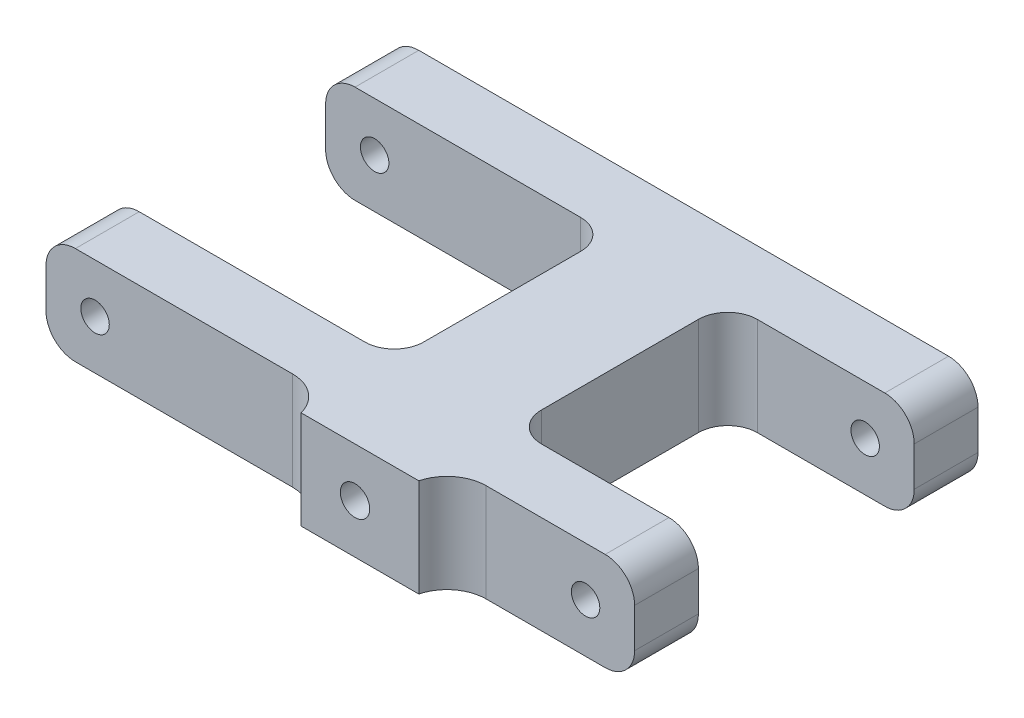
ISO-10303-21;
HEADER;
FILE_DESCRIPTION(('STEP AP214'),'2;1');
FILE_NAME('part.step','',(''),(''),'','','');
FILE_SCHEMA(('AUTOMOTIVE_DESIGN { 1 0 10303 214 1 1 1 1 }'));
ENDSEC;
DATA;
#1=APPLICATION_CONTEXT('core data for automotive mechanical design processes');
#2=APPLICATION_PROTOCOL_DEFINITION('international standard','automotive_design',2000,#1);
#3=PRODUCT_CONTEXT('',#1,'mechanical');
#4=PRODUCT('Part','Part','',(#3));
#5=PRODUCT_RELATED_PRODUCT_CATEGORY('part','',(#4));
#6=PRODUCT_DEFINITION_FORMATION('','',#4);
#7=PRODUCT_DEFINITION_CONTEXT('part definition',#1,'design');
#8=PRODUCT_DEFINITION('design','',#6,#7);
#9=PRODUCT_DEFINITION_SHAPE('','',#8);
#10=(LENGTH_UNIT() NAMED_UNIT(*) SI_UNIT(.MILLI.,.METRE.));
#11=(NAMED_UNIT(*) PLANE_ANGLE_UNIT() SI_UNIT($,.RADIAN.));
#12=(NAMED_UNIT(*) SI_UNIT($,.STERADIAN.) SOLID_ANGLE_UNIT());
#13=UNCERTAINTY_MEASURE_WITH_UNIT(LENGTH_MEASURE(1.E-05),#10,'distance_accuracy_value','');
#14=(GEOMETRIC_REPRESENTATION_CONTEXT(3) GLOBAL_UNCERTAINTY_ASSIGNED_CONTEXT((#13)) GLOBAL_UNIT_ASSIGNED_CONTEXT((#10,
#11,#12)) REPRESENTATION_CONTEXT('',''));
#15=CARTESIAN_POINT('',(0.,0.,0.));
#16=DIRECTION('',(0.,0.,1.));
#17=DIRECTION('',(1.,0.,0.));
#18=AXIS2_PLACEMENT_3D('',#15,#16,#17);
#19=CARTESIAN_POINT('',(0.,10.,35.));
#20=DIRECTION('',(0.,0.,-1.));
#21=DIRECTION('',(-1.,0.,0.));
#22=AXIS2_PLACEMENT_3D('',#19,#20,#21);
#23=PLANE('',#22);
#24=CARTESIAN_POINT('',(5.,5.,35.));
#25=DIRECTION('',(0.,0.,1.));
#26=DIRECTION('',(1.,0.,0.));
#27=AXIS2_PLACEMENT_3D('',#24,#25,#26);
#28=CIRCLE('',#27,1.45);
#29=CARTESIAN_POINT('',(6.45,5.,35.));
#30=VERTEX_POINT('',#29);
#31=EDGE_CURVE('E254',#30,#30,#28,.T.);
#32=ORIENTED_EDGE('',*,*,#31,.F.);
#33=EDGE_LOOP('',(#32));
#34=FACE_BOUND('',#33,.T.);
#35=DIRECTION('',(1.,0.,0.));
#36=VECTOR('',#35,1.);
#37=CARTESIAN_POINT('',(0.,0.,35.));
#38=LINE('',#37,#36);
#39=CARTESIAN_POINT('',(3.,0.,35.));
#40=VERTEX_POINT('',#39);
#41=CARTESIAN_POINT('',(25.1270166537926,0.,35.));
#42=VERTEX_POINT('',#41);
#43=EDGE_CURVE('E312',#40,#42,#38,.T.);
#44=ORIENTED_EDGE('',*,*,#43,.T.);
#45=DIRECTION('',(0.,-1.,0.));
#46=VECTOR('',#45,1.);
#47=CARTESIAN_POINT('',(25.1270166537926,10.,35.));
#48=LINE('',#47,#46);
#49=CARTESIAN_POINT('',(25.1270166537926,10.,35.));
#50=VERTEX_POINT('',#49);
#51=EDGE_CURVE('E54',#42,#50,#48,.F.);
#52=ORIENTED_EDGE('',*,*,#51,.T.);
#53=DIRECTION('',(1.,0.,0.));
#54=VECTOR('',#53,1.);
#55=CARTESIAN_POINT('',(0.,10.,35.));
#56=LINE('',#55,#54);
#57=CARTESIAN_POINT('',(3.,10.,35.));
#58=VERTEX_POINT('',#57);
#59=EDGE_CURVE('E305',#58,#50,#56,.T.);
#60=ORIENTED_EDGE('',*,*,#59,.F.);
#61=CARTESIAN_POINT('',(3.,7.,35.));
#62=DIRECTION('',(0.,0.,-1.));
#63=DIRECTION('',(-1.,0.,0.));
#64=AXIS2_PLACEMENT_3D('',#61,#62,#63);
#65=CIRCLE('',#64,3.);
#66=CARTESIAN_POINT('',(0.,7.,35.));
#67=VERTEX_POINT('',#66);
#68=EDGE_CURVE('E342',#58,#67,#65,.F.);
#69=ORIENTED_EDGE('',*,*,#68,.T.);
#70=DIRECTION('',(0.,-1.,0.));
#71=VECTOR('',#70,1.);
#72=CARTESIAN_POINT('',(0.,10.,35.));
#73=LINE('',#72,#71);
#74=CARTESIAN_POINT('',(0.,3.,35.));
#75=VERTEX_POINT('',#74);
#76=EDGE_CURVE('E325',#67,#75,#73,.T.);
#77=ORIENTED_EDGE('',*,*,#76,.T.);
#78=CARTESIAN_POINT('',(3.,3.,35.));
#79=DIRECTION('',(0.,0.,-1.));
#80=DIRECTION('',(-1.,0.,0.));
#81=AXIS2_PLACEMENT_3D('',#78,#79,#80);
#82=CIRCLE('',#81,3.);
#83=EDGE_CURVE('E344',#75,#40,#82,.F.);
#84=ORIENTED_EDGE('',*,*,#83,.T.);
#85=EDGE_LOOP('',(#44,#52,#60,#69,#77,#84));
#86=FACE_BOUND('',#85,.T.);
#87=ADVANCED_FACE('F33',(#34,#86),#23,.F.);
#88=CARTESIAN_POINT('',(55.,5.,35.));
#89=DIRECTION('',(0.,0.,1.));
#90=DIRECTION('',(1.,0.,0.));
#91=AXIS2_PLACEMENT_3D('',#88,#89,#90);
#92=CIRCLE('',#91,1.45);
#93=CARTESIAN_POINT('',(56.45,5.,35.));
#94=VERTEX_POINT('',#93);
#95=EDGE_CURVE('E244',#94,#94,#92,.T.);
#96=ORIENTED_EDGE('',*,*,#95,.F.);
#97=EDGE_LOOP('',(#96));
#98=FACE_BOUND('',#97,.T.);
#99=CARTESIAN_POINT('',(44.8729833462074,10.,35.));
#100=VERTEX_POINT('',#99);
#101=CARTESIAN_POINT('',(57.,10.,35.));
#102=VERTEX_POINT('',#101);
#103=EDGE_CURVE('E308',#100,#102,#56,.T.);
#104=ORIENTED_EDGE('',*,*,#103,.F.);
#105=DIRECTION('',(0.,1.,0.));
#106=VECTOR('',#105,1.);
#107=CARTESIAN_POINT('',(44.8729833462074,10.,35.));
#108=LINE('',#107,#106);
#109=CARTESIAN_POINT('',(44.8729833462074,0.,35.));
#110=VERTEX_POINT('',#109);
#111=EDGE_CURVE('E448',#100,#110,#108,.F.);
#112=ORIENTED_EDGE('',*,*,#111,.T.);
#113=CARTESIAN_POINT('',(57.,0.,35.));
#114=VERTEX_POINT('',#113);
#115=EDGE_CURVE('E299',#110,#114,#38,.T.);
#116=ORIENTED_EDGE('',*,*,#115,.T.);
#117=CARTESIAN_POINT('',(57.,3.,35.));
#118=DIRECTION('',(0.,0.,-1.));
#119=DIRECTION('',(-1.,0.,0.));
#120=AXIS2_PLACEMENT_3D('',#117,#118,#119);
#121=CIRCLE('',#120,3.);
#122=CARTESIAN_POINT('',(60.,3.,35.));
#123=VERTEX_POINT('',#122);
#124=EDGE_CURVE('E340',#114,#123,#121,.F.);
#125=ORIENTED_EDGE('',*,*,#124,.T.);
#126=DIRECTION('',(0.,-1.,0.));
#127=VECTOR('',#126,1.);
#128=CARTESIAN_POINT('',(60.,10.,35.));
#129=LINE('',#128,#127);
#130=CARTESIAN_POINT('',(60.,7.,35.));
#131=VERTEX_POINT('',#130);
#132=EDGE_CURVE('E322',#131,#123,#129,.T.);
#133=ORIENTED_EDGE('',*,*,#132,.F.);
#134=CARTESIAN_POINT('',(57.,7.,35.));
#135=DIRECTION('',(0.,0.,-1.));
#136=DIRECTION('',(-1.,0.,0.));
#137=AXIS2_PLACEMENT_3D('',#134,#135,#136);
#138=CIRCLE('',#137,3.);
#139=EDGE_CURVE('E337',#131,#102,#138,.F.);
#140=ORIENTED_EDGE('',*,*,#139,.T.);
#141=EDGE_LOOP('',(#104,#112,#116,#125,#133,#140));
#142=FACE_BOUND('',#141,.T.);
#143=ADVANCED_FACE('F460',(#98,#142),#23,.F.);
#144=CARTESIAN_POINT('',(0.,10.,0.));
#145=DIRECTION('',(1.,0.,0.));
#146=DIRECTION('',(0.,0.,-1.));
#147=AXIS2_PLACEMENT_3D('',#144,#145,#146);
#148=PLANE('',#147);
#149=DIRECTION('',(0.,-1.,0.));
#150=VECTOR('',#149,1.);
#151=CARTESIAN_POINT('',(0.,10.,0.));
#152=LINE('',#151,#150);
#153=CARTESIAN_POINT('',(0.,7.,0.));
#154=VERTEX_POINT('',#153);
#155=CARTESIAN_POINT('',(0.,3.,0.));
#156=VERTEX_POINT('',#155);
#157=EDGE_CURVE('E311',#154,#156,#152,.T.);
#158=ORIENTED_EDGE('',*,*,#157,.T.);
#159=DIRECTION('',(0.,0.,1.));
#160=VECTOR('',#159,1.);
#161=CARTESIAN_POINT('',(0.,3.,0.));
#162=LINE('',#161,#160);
#163=CARTESIAN_POINT('',(0.,3.,6.5));
#164=VERTEX_POINT('',#163);
#165=EDGE_CURVE('E376',#156,#164,#162,.T.);
#166=ORIENTED_EDGE('',*,*,#165,.T.);
#167=DIRECTION('',(0.,-1.,0.));
#168=VECTOR('',#167,1.);
#169=CARTESIAN_POINT('',(0.,10.,6.5));
#170=LINE('',#169,#168);
#171=CARTESIAN_POINT('',(0.,7.,6.5));
#172=VERTEX_POINT('',#171);
#173=EDGE_CURVE('E264',#172,#164,#170,.T.);
#174=ORIENTED_EDGE('',*,*,#173,.F.);
#175=DIRECTION('',(0.,0.,1.));
#176=VECTOR('',#175,1.);
#177=CARTESIAN_POINT('',(0.,7.,0.));
#178=LINE('',#177,#176);
#179=EDGE_CURVE('E374',#172,#154,#178,.F.);
#180=ORIENTED_EDGE('',*,*,#179,.T.);
#181=EDGE_LOOP('',(#158,#166,#174,#180));
#182=FACE_BOUND('',#181,.T.);
#183=ADVANCED_FACE('F481',(#182),#148,.F.);
#184=CARTESIAN_POINT('',(60.,10.,0.));
#185=DIRECTION('',(-1.,0.,0.));
#186=DIRECTION('',(0.,0.,1.));
#187=AXIS2_PLACEMENT_3D('',#184,#185,#186);
#188=PLANE('',#187);
#189=ORIENTED_EDGE('',*,*,#132,.T.);
#190=DIRECTION('',(0.,0.,-1.));
#191=VECTOR('',#190,1.);
#192=CARTESIAN_POINT('',(60.,3.,0.));
#193=LINE('',#192,#191);
#194=CARTESIAN_POINT('',(60.,3.,28.5));
#195=VERTEX_POINT('',#194);
#196=EDGE_CURVE('E404',#123,#195,#193,.T.);
#197=ORIENTED_EDGE('',*,*,#196,.T.);
#198=DIRECTION('',(0.,-1.,0.));
#199=VECTOR('',#198,1.);
#200=CARTESIAN_POINT('',(60.,10.,28.5));
#201=LINE('',#200,#199);
#202=CARTESIAN_POINT('',(60.,7.,28.5));
#203=VERTEX_POINT('',#202);
#204=EDGE_CURVE('E279',#203,#195,#201,.T.);
#205=ORIENTED_EDGE('',*,*,#204,.F.);
#206=DIRECTION('',(0.,0.,-1.));
#207=VECTOR('',#206,1.);
#208=CARTESIAN_POINT('',(60.,7.,35.));
#209=LINE('',#208,#207);
#210=EDGE_CURVE('E402',#203,#131,#209,.F.);
#211=ORIENTED_EDGE('',*,*,#210,.T.);
#212=EDGE_LOOP('',(#189,#197,#205,#211));
#213=FACE_BOUND('',#212,.T.);
#214=ADVANCED_FACE('F491',(#213),#188,.F.);
#215=DIRECTION('',(0.,1.,0.));
#216=VECTOR('',#215,1.);
#217=CARTESIAN_POINT('',(0.,10.,28.5));
#218=LINE('',#217,#216);
#219=CARTESIAN_POINT('',(0.,3.,28.5));
#220=VERTEX_POINT('',#219);
#221=CARTESIAN_POINT('',(0.,7.,28.5));
#222=VERTEX_POINT('',#221);
#223=EDGE_CURVE('E269',#220,#222,#218,.T.);
#224=ORIENTED_EDGE('',*,*,#223,.F.);
#225=DIRECTION('',(0.,0.,1.));
#226=VECTOR('',#225,1.);
#227=CARTESIAN_POINT('',(0.,3.,0.));
#228=LINE('',#227,#226);
#229=EDGE_CURVE('E334',#220,#75,#228,.T.);
#230=ORIENTED_EDGE('',*,*,#229,.T.);
#231=ORIENTED_EDGE('',*,*,#76,.F.);
#232=DIRECTION('',(0.,0.,1.));
#233=VECTOR('',#232,1.);
#234=CARTESIAN_POINT('',(0.,7.,28.5));
#235=LINE('',#234,#233);
#236=EDGE_CURVE('E328',#67,#222,#235,.F.);
#237=ORIENTED_EDGE('',*,*,#236,.T.);
#238=EDGE_LOOP('',(#224,#230,#231,#237));
#239=FACE_BOUND('',#238,.T.);
#240=ADVANCED_FACE('F488',(#239),#148,.F.);
#241=DIRECTION('',(0.,-1.,0.));
#242=VECTOR('',#241,1.);
#243=CARTESIAN_POINT('',(60.,10.,0.));
#244=LINE('',#243,#242);
#245=CARTESIAN_POINT('',(60.,7.,0.));
#246=VERTEX_POINT('',#245);
#247=CARTESIAN_POINT('',(60.,3.,0.));
#248=VERTEX_POINT('',#247);
#249=EDGE_CURVE('E319',#246,#248,#244,.T.);
#250=ORIENTED_EDGE('',*,*,#249,.F.);
#251=DIRECTION('',(0.,0.,-1.));
#252=VECTOR('',#251,1.);
#253=CARTESIAN_POINT('',(60.,7.,6.5));
#254=LINE('',#253,#252);
#255=CARTESIAN_POINT('',(60.,7.,6.5));
#256=VERTEX_POINT('',#255);
#257=EDGE_CURVE('E395',#246,#256,#254,.F.);
#258=ORIENTED_EDGE('',*,*,#257,.T.);
#259=DIRECTION('',(0.,1.,0.));
#260=VECTOR('',#259,1.);
#261=CARTESIAN_POINT('',(60.,10.,6.5));
#262=LINE('',#261,#260);
#263=CARTESIAN_POINT('',(60.,3.,6.5));
#264=VERTEX_POINT('',#263);
#265=EDGE_CURVE('E289',#264,#256,#262,.T.);
#266=ORIENTED_EDGE('',*,*,#265,.F.);
#267=DIRECTION('',(0.,0.,-1.));
#268=VECTOR('',#267,1.);
#269=CARTESIAN_POINT('',(60.,3.,0.));
#270=LINE('',#269,#268);
#271=EDGE_CURVE('E392',#264,#248,#270,.T.);
#272=ORIENTED_EDGE('',*,*,#271,.T.);
#273=EDGE_LOOP('',(#250,#258,#266,#272));
#274=FACE_BOUND('',#273,.T.);
#275=ADVANCED_FACE('F486',(#274),#188,.F.);
#276=CARTESIAN_POINT('',(0.,10.,0.));
#277=DIRECTION('',(0.,0.,1.));
#278=DIRECTION('',(1.,0.,0.));
#279=AXIS2_PLACEMENT_3D('',#276,#277,#278);
#280=PLANE('',#279);
#281=CARTESIAN_POINT('',(55.,5.,0.));
#282=DIRECTION('',(0.,0.,1.));
#283=DIRECTION('',(1.,0.,0.));
#284=AXIS2_PLACEMENT_3D('',#281,#282,#283);
#285=CIRCLE('',#284,1.45);
#286=CARTESIAN_POINT('',(56.45,5.,0.));
#287=VERTEX_POINT('',#286);
#288=EDGE_CURVE('E245',#287,#287,#285,.T.);
#289=ORIENTED_EDGE('',*,*,#288,.T.);
#290=EDGE_LOOP('',(#289));
#291=FACE_BOUND('',#290,.T.);
#292=CARTESIAN_POINT('',(5.,5.,0.));
#293=DIRECTION('',(0.,0.,1.));
#294=DIRECTION('',(1.,0.,0.));
#295=AXIS2_PLACEMENT_3D('',#292,#293,#294);
#296=CIRCLE('',#295,1.45);
#297=CARTESIAN_POINT('',(6.45,5.,0.));
#298=VERTEX_POINT('',#297);
#299=EDGE_CURVE('E255',#298,#298,#296,.T.);
#300=ORIENTED_EDGE('',*,*,#299,.T.);
#301=EDGE_LOOP('',(#300));
#302=FACE_BOUND('',#301,.T.);
#303=DIRECTION('',(-1.,0.,0.));
#304=VECTOR('',#303,1.);
#305=CARTESIAN_POINT('',(0.,0.,0.));
#306=LINE('',#305,#304);
#307=CARTESIAN_POINT('',(57.,0.,0.));
#308=VERTEX_POINT('',#307);
#309=CARTESIAN_POINT('',(3.,0.,0.));
#310=VERTEX_POINT('',#309);
#311=EDGE_CURVE('E314',#308,#310,#306,.T.);
#312=ORIENTED_EDGE('',*,*,#311,.T.);
#313=CARTESIAN_POINT('',(3.,3.,0.));
#314=DIRECTION('',(0.,0.,1.));
#315=DIRECTION('',(1.,0.,0.));
#316=AXIS2_PLACEMENT_3D('',#313,#314,#315);
#317=CIRCLE('',#316,3.);
#318=EDGE_CURVE('E390',#310,#156,#317,.F.);
#319=ORIENTED_EDGE('',*,*,#318,.T.);
#320=ORIENTED_EDGE('',*,*,#157,.F.);
#321=CARTESIAN_POINT('',(3.,7.,0.));
#322=DIRECTION('',(0.,0.,1.));
#323=DIRECTION('',(1.,0.,0.));
#324=AXIS2_PLACEMENT_3D('',#321,#322,#323);
#325=CIRCLE('',#324,3.);
#326=CARTESIAN_POINT('',(3.,10.,0.));
#327=VERTEX_POINT('',#326);
#328=EDGE_CURVE('E388',#154,#327,#325,.F.);
#329=ORIENTED_EDGE('',*,*,#328,.T.);
#330=DIRECTION('',(-1.,0.,0.));
#331=VECTOR('',#330,1.);
#332=CARTESIAN_POINT('',(0.,10.,0.));
#333=LINE('',#332,#331);
#334=CARTESIAN_POINT('',(57.,10.,0.));
#335=VERTEX_POINT('',#334);
#336=EDGE_CURVE('E307',#335,#327,#333,.T.);
#337=ORIENTED_EDGE('',*,*,#336,.F.);
#338=CARTESIAN_POINT('',(57.,7.,0.));
#339=DIRECTION('',(0.,0.,1.));
#340=DIRECTION('',(1.,0.,0.));
#341=AXIS2_PLACEMENT_3D('',#338,#339,#340);
#342=CIRCLE('',#341,3.);
#343=EDGE_CURVE('E386',#335,#246,#342,.F.);
#344=ORIENTED_EDGE('',*,*,#343,.T.);
#345=ORIENTED_EDGE('',*,*,#249,.T.);
#346=CARTESIAN_POINT('',(57.,3.,0.));
#347=DIRECTION('',(0.,0.,1.));
#348=DIRECTION('',(1.,0.,0.));
#349=AXIS2_PLACEMENT_3D('',#346,#347,#348);
#350=CIRCLE('',#349,3.);
#351=EDGE_CURVE('E384',#248,#308,#350,.F.);
#352=ORIENTED_EDGE('',*,*,#351,.T.);
#353=EDGE_LOOP('',(#312,#319,#320,#329,#337,#344,#345,#352));
#354=FACE_BOUND('',#353,.T.);
#355=ADVANCED_FACE('F577',(#291,#302,#354),#280,.F.);
#356=CARTESIAN_POINT('',(0.,10.,0.));
#357=DIRECTION('',(0.,1.,0.));
#358=DIRECTION('',(0.,0.,1.));
#359=AXIS2_PLACEMENT_3D('',#356,#357,#358);
#360=PLANE('',#359);
#361=DIRECTION('',(0.,0.,-1.));
#362=VECTOR('',#361,1.);
#363=CARTESIAN_POINT('',(29.,10.,6.5));
#364=LINE('',#363,#362);
#365=CARTESIAN_POINT('',(29.,10.,25.5));
#366=VERTEX_POINT('',#365);
#367=CARTESIAN_POINT('',(29.,10.,9.5));
#368=VERTEX_POINT('',#367);
#369=EDGE_CURVE('E268',#366,#368,#364,.T.);
#370=ORIENTED_EDGE('',*,*,#369,.F.);
#371=CARTESIAN_POINT('',(26.,10.,25.5));
#372=DIRECTION('',(0.,1.,0.));
#373=DIRECTION('',(0.,0.,1.));
#374=AXIS2_PLACEMENT_3D('',#371,#372,#373);
#375=CIRCLE('',#374,3.);
#376=CARTESIAN_POINT('',(26.,10.,28.5));
#377=VERTEX_POINT('',#376);
#378=EDGE_CURVE('E440',#366,#377,#375,.F.);
#379=ORIENTED_EDGE('',*,*,#378,.T.);
#380=DIRECTION('',(-1.,0.,0.));
#381=VECTOR('',#380,1.);
#382=CARTESIAN_POINT('',(29.,10.,28.5));
#383=LINE('',#382,#381);
#384=CARTESIAN_POINT('',(3.00000000000001,10.,28.5));
#385=VERTEX_POINT('',#384);
#386=EDGE_CURVE('E280',#377,#385,#383,.T.);
#387=ORIENTED_EDGE('',*,*,#386,.T.);
#388=DIRECTION('',(0.,0.,1.));
#389=VECTOR('',#388,1.);
#390=CARTESIAN_POINT('',(3.,10.,35.));
#391=LINE('',#390,#389);
#392=EDGE_CURVE('E371',#385,#58,#391,.T.);
#393=ORIENTED_EDGE('',*,*,#392,.T.);
#394=ORIENTED_EDGE('',*,*,#59,.T.);
#395=CARTESIAN_POINT('',(25.1270166537926,10.,39.));
#396=DIRECTION('',(0.,1.,0.));
#397=DIRECTION('',(0.,0.,1.));
#398=AXIS2_PLACEMENT_3D('',#395,#396,#397);
#399=CIRCLE('',#398,4.);
#400=CARTESIAN_POINT('',(29.,10.,38.));
#401=VERTEX_POINT('',#400);
#402=EDGE_CURVE('E11',#50,#401,#399,.F.);
#403=ORIENTED_EDGE('',*,*,#402,.T.);
#404=DIRECTION('',(-1.,0.,0.));
#405=VECTOR('',#404,1.);
#406=CARTESIAN_POINT('',(29.,10.,38.));
#407=LINE('',#406,#405);
#408=CARTESIAN_POINT('',(41.,10.,38.));
#409=VERTEX_POINT('',#408);
#410=EDGE_CURVE('E234',#409,#401,#407,.T.);
#411=ORIENTED_EDGE('',*,*,#410,.F.);
#412=CARTESIAN_POINT('',(44.8729833462074,10.,39.));
#413=DIRECTION('',(0.,1.,0.));
#414=DIRECTION('',(0.,0.,1.));
#415=AXIS2_PLACEMENT_3D('',#412,#413,#414);
#416=CIRCLE('',#415,4.);
#417=EDGE_CURVE('E451',#409,#100,#416,.F.);
#418=ORIENTED_EDGE('',*,*,#417,.T.);
#419=ORIENTED_EDGE('',*,*,#103,.T.);
#420=DIRECTION('',(0.,0.,-1.));
#421=VECTOR('',#420,1.);
#422=CARTESIAN_POINT('',(57.,10.,28.5));
#423=LINE('',#422,#421);
#424=CARTESIAN_POINT('',(57.,10.,28.5));
#425=VERTEX_POINT('',#424);
#426=EDGE_CURVE('E362',#102,#425,#423,.T.);
#427=ORIENTED_EDGE('',*,*,#426,.T.);
#428=DIRECTION('',(1.,0.,0.));
#429=VECTOR('',#428,1.);
#430=CARTESIAN_POINT('',(41.,10.,28.5));
#431=LINE('',#430,#429);
#432=CARTESIAN_POINT('',(44.,10.,28.5));
#433=VERTEX_POINT('',#432);
#434=EDGE_CURVE('E297',#433,#425,#431,.T.);
#435=ORIENTED_EDGE('',*,*,#434,.F.);
#436=CARTESIAN_POINT('',(44.,10.,25.5));
#437=DIRECTION('',(0.,1.,0.));
#438=DIRECTION('',(0.,0.,1.));
#439=AXIS2_PLACEMENT_3D('',#436,#437,#438);
#440=CIRCLE('',#439,3.);
#441=CARTESIAN_POINT('',(41.,10.,25.5));
#442=VERTEX_POINT('',#441);
#443=EDGE_CURVE('E434',#433,#442,#440,.F.);
#444=ORIENTED_EDGE('',*,*,#443,.T.);
#445=DIRECTION('',(0.,0.,1.));
#446=VECTOR('',#445,1.);
#447=CARTESIAN_POINT('',(41.,10.,28.5));
#448=LINE('',#447,#446);
#449=CARTESIAN_POINT('',(41.,10.,9.5));
#450=VERTEX_POINT('',#449);
#451=EDGE_CURVE('E288',#450,#442,#448,.T.);
#452=ORIENTED_EDGE('',*,*,#451,.F.);
#453=CARTESIAN_POINT('',(44.,10.,9.5));
#454=DIRECTION('',(0.,1.,0.));
#455=DIRECTION('',(0.,0.,1.));
#456=AXIS2_PLACEMENT_3D('',#453,#454,#455);
#457=CIRCLE('',#456,3.);
#458=CARTESIAN_POINT('',(44.,10.,6.5));
#459=VERTEX_POINT('',#458);
#460=EDGE_CURVE('E436',#450,#459,#457,.F.);
#461=ORIENTED_EDGE('',*,*,#460,.T.);
#462=DIRECTION('',(1.,0.,0.));
#463=VECTOR('',#462,1.);
#464=CARTESIAN_POINT('',(41.,10.,6.5));
#465=LINE('',#464,#463);
#466=CARTESIAN_POINT('',(57.,10.,6.5));
#467=VERTEX_POINT('',#466);
#468=EDGE_CURVE('E300',#459,#467,#465,.T.);
#469=ORIENTED_EDGE('',*,*,#468,.T.);
#470=DIRECTION('',(0.,0.,-1.));
#471=VECTOR('',#470,1.);
#472=CARTESIAN_POINT('',(57.,10.,0.));
#473=LINE('',#472,#471);
#474=EDGE_CURVE('E365',#467,#335,#473,.T.);
#475=ORIENTED_EDGE('',*,*,#474,.T.);
#476=ORIENTED_EDGE('',*,*,#336,.T.);
#477=DIRECTION('',(0.,0.,1.));
#478=VECTOR('',#477,1.);
#479=CARTESIAN_POINT('',(3.,10.,6.5));
#480=LINE('',#479,#478);
#481=CARTESIAN_POINT('',(3.00000000000001,10.,6.5));
#482=VERTEX_POINT('',#481);
#483=EDGE_CURVE('E368',#327,#482,#480,.T.);
#484=ORIENTED_EDGE('',*,*,#483,.T.);
#485=DIRECTION('',(-1.,0.,0.));
#486=VECTOR('',#485,1.);
#487=CARTESIAN_POINT('',(29.,10.,6.5));
#488=LINE('',#487,#486);
#489=CARTESIAN_POINT('',(26.,10.,6.5));
#490=VERTEX_POINT('',#489);
#491=EDGE_CURVE('E277',#490,#482,#488,.T.);
#492=ORIENTED_EDGE('',*,*,#491,.F.);
#493=CARTESIAN_POINT('',(26.,10.,9.5));
#494=DIRECTION('',(0.,1.,0.));
#495=DIRECTION('',(0.,0.,1.));
#496=AXIS2_PLACEMENT_3D('',#493,#494,#495);
#497=CIRCLE('',#496,3.);
#498=EDGE_CURVE('E446',#490,#368,#497,.F.);
#499=ORIENTED_EDGE('',*,*,#498,.T.);
#500=EDGE_LOOP('',(#370,#379,#387,#393,#394,#403,#411,#418,#419,#427,#435,#444,#452,#461,#469,
#475,#476,#484,#492,#499));
#501=FACE_BOUND('',#500,.T.);
#502=ADVANCED_FACE('F456',(#501),#360,.T.);
#503=CARTESIAN_POINT('',(0.,0.,0.));
#504=DIRECTION('',(0.,1.,0.));
#505=DIRECTION('',(0.,0.,1.));
#506=AXIS2_PLACEMENT_3D('',#503,#504,#505);
#507=PLANE('',#506);
#508=ORIENTED_EDGE('',*,*,#43,.F.);
#509=DIRECTION('',(0.,0.,1.));
#510=VECTOR('',#509,1.);
#511=CARTESIAN_POINT('',(3.,0.,0.));
#512=LINE('',#511,#510);
#513=CARTESIAN_POINT('',(3.00000000000001,0.,28.5));
#514=VERTEX_POINT('',#513);
#515=EDGE_CURVE('E354',#40,#514,#512,.F.);
#516=ORIENTED_EDGE('',*,*,#515,.T.);
#517=DIRECTION('',(-1.,0.,0.));
#518=VECTOR('',#517,1.);
#519=CARTESIAN_POINT('',(29.,0.,28.5));
#520=LINE('',#519,#518);
#521=CARTESIAN_POINT('',(26.,0.,28.5));
#522=VERTEX_POINT('',#521);
#523=EDGE_CURVE('E282',#522,#514,#520,.T.);
#524=ORIENTED_EDGE('',*,*,#523,.F.);
#525=CARTESIAN_POINT('',(26.,0.,25.5));
#526=DIRECTION('',(0.,1.,0.));
#527=DIRECTION('',(0.,0.,1.));
#528=AXIS2_PLACEMENT_3D('',#525,#526,#527);
#529=CIRCLE('',#528,3.);
#530=CARTESIAN_POINT('',(29.,0.,25.5));
#531=VERTEX_POINT('',#530);
#532=EDGE_CURVE('E442',#522,#531,#529,.T.);
#533=ORIENTED_EDGE('',*,*,#532,.T.);
#534=DIRECTION('',(0.,0.,1.));
#535=VECTOR('',#534,1.);
#536=CARTESIAN_POINT('',(29.,0.,6.5));
#537=LINE('',#536,#535);
#538=CARTESIAN_POINT('',(29.,0.,9.5));
#539=VERTEX_POINT('',#538);
#540=EDGE_CURVE('E265',#539,#531,#537,.T.);
#541=ORIENTED_EDGE('',*,*,#540,.F.);
#542=CARTESIAN_POINT('',(26.,0.,9.5));
#543=DIRECTION('',(0.,1.,0.));
#544=DIRECTION('',(0.,0.,1.));
#545=AXIS2_PLACEMENT_3D('',#542,#543,#544);
#546=CIRCLE('',#545,3.);
#547=CARTESIAN_POINT('',(26.,0.,6.5));
#548=VERTEX_POINT('',#547);
#549=EDGE_CURVE('E444',#539,#548,#546,.T.);
#550=ORIENTED_EDGE('',*,*,#549,.T.);
#551=DIRECTION('',(-1.,0.,0.));
#552=VECTOR('',#551,1.);
#553=CARTESIAN_POINT('',(29.,0.,6.5));
#554=LINE('',#553,#552);
#555=CARTESIAN_POINT('',(3.00000000000001,0.,6.5));
#556=VERTEX_POINT('',#555);
#557=EDGE_CURVE('E272',#548,#556,#554,.T.);
#558=ORIENTED_EDGE('',*,*,#557,.T.);
#559=DIRECTION('',(0.,0.,1.));
#560=VECTOR('',#559,1.);
#561=CARTESIAN_POINT('',(3.,0.,0.));
#562=LINE('',#561,#560);
#563=EDGE_CURVE('E352',#556,#310,#562,.F.);
#564=ORIENTED_EDGE('',*,*,#563,.T.);
#565=ORIENTED_EDGE('',*,*,#311,.F.);
#566=DIRECTION('',(0.,0.,-1.));
#567=VECTOR('',#566,1.);
#568=CARTESIAN_POINT('',(57.,0.,0.));
#569=LINE('',#568,#567);
#570=CARTESIAN_POINT('',(57.,0.,6.5));
#571=VERTEX_POINT('',#570);
#572=EDGE_CURVE('E349',#308,#571,#569,.F.);
#573=ORIENTED_EDGE('',*,*,#572,.T.);
#574=DIRECTION('',(1.,0.,0.));
#575=VECTOR('',#574,1.);
#576=CARTESIAN_POINT('',(41.,0.,6.5));
#577=LINE('',#576,#575);
#578=CARTESIAN_POINT('',(44.,0.,6.5));
#579=VERTEX_POINT('',#578);
#580=EDGE_CURVE('E302',#579,#571,#577,.T.);
#581=ORIENTED_EDGE('',*,*,#580,.F.);
#582=CARTESIAN_POINT('',(44.,0.,9.5));
#583=DIRECTION('',(0.,1.,0.));
#584=DIRECTION('',(0.,0.,1.));
#585=AXIS2_PLACEMENT_3D('',#582,#583,#584);
#586=CIRCLE('',#585,3.);
#587=CARTESIAN_POINT('',(41.,0.,9.5));
#588=VERTEX_POINT('',#587);
#589=EDGE_CURVE('E438',#579,#588,#586,.T.);
#590=ORIENTED_EDGE('',*,*,#589,.T.);
#591=DIRECTION('',(0.,0.,-1.));
#592=VECTOR('',#591,1.);
#593=CARTESIAN_POINT('',(41.,0.,28.5));
#594=LINE('',#593,#592);
#595=CARTESIAN_POINT('',(41.,0.,25.5));
#596=VERTEX_POINT('',#595);
#597=EDGE_CURVE('E285',#596,#588,#594,.T.);
#598=ORIENTED_EDGE('',*,*,#597,.F.);
#599=CARTESIAN_POINT('',(44.,0.,25.5));
#600=DIRECTION('',(0.,1.,0.));
#601=DIRECTION('',(0.,0.,1.));
#602=AXIS2_PLACEMENT_3D('',#599,#600,#601);
#603=CIRCLE('',#602,3.);
#604=CARTESIAN_POINT('',(44.,0.,28.5));
#605=VERTEX_POINT('',#604);
#606=EDGE_CURVE('E432',#596,#605,#603,.T.);
#607=ORIENTED_EDGE('',*,*,#606,.T.);
#608=DIRECTION('',(1.,0.,0.));
#609=VECTOR('',#608,1.);
#610=CARTESIAN_POINT('',(41.,0.,28.5));
#611=LINE('',#610,#609);
#612=CARTESIAN_POINT('',(57.,0.,28.5));
#613=VERTEX_POINT('',#612);
#614=EDGE_CURVE('E292',#605,#613,#611,.T.);
#615=ORIENTED_EDGE('',*,*,#614,.T.);
#616=DIRECTION('',(0.,0.,-1.));
#617=VECTOR('',#616,1.);
#618=CARTESIAN_POINT('',(57.,0.,0.));
#619=LINE('',#618,#617);
#620=EDGE_CURVE('E346',#613,#114,#619,.F.);
#621=ORIENTED_EDGE('',*,*,#620,.T.);
#622=ORIENTED_EDGE('',*,*,#115,.F.);
#623=CARTESIAN_POINT('',(44.8729833462074,0.,39.));
#624=DIRECTION('',(0.,1.,0.));
#625=DIRECTION('',(0.,0.,1.));
#626=AXIS2_PLACEMENT_3D('',#623,#624,#625);
#627=CIRCLE('',#626,4.);
#628=CARTESIAN_POINT('',(41.,0.,38.));
#629=VERTEX_POINT('',#628);
#630=EDGE_CURVE('E220',#110,#629,#627,.T.);
#631=ORIENTED_EDGE('',*,*,#630,.T.);
#632=DIRECTION('',(1.,0.,0.));
#633=VECTOR('',#632,1.);
#634=CARTESIAN_POINT('',(29.,0.,38.));
#635=LINE('',#634,#633);
#636=CARTESIAN_POINT('',(29.,0.,38.));
#637=VERTEX_POINT('',#636);
#638=EDGE_CURVE('E222',#637,#629,#635,.T.);
#639=ORIENTED_EDGE('',*,*,#638,.F.);
#640=CARTESIAN_POINT('',(25.1270166537926,0.,39.));
#641=DIRECTION('',(0.,1.,0.));
#642=DIRECTION('',(0.,0.,1.));
#643=AXIS2_PLACEMENT_3D('',#640,#641,#642);
#644=CIRCLE('',#643,4.);
#645=EDGE_CURVE('E41',#637,#42,#644,.T.);
#646=ORIENTED_EDGE('',*,*,#645,.T.);
#647=EDGE_LOOP('',(#508,#516,#524,#533,#541,#550,#558,#564,#565,#573,#581,#590,#598,#607,#615,
#621,#622,#631,#639,#646));
#648=FACE_BOUND('',#647,.T.);
#649=ADVANCED_FACE('F223',(#648),#507,.F.);
#650=CARTESIAN_POINT('',(41.,10.,28.5));
#651=DIRECTION('',(0.,0.,1.));
#652=DIRECTION('',(1.,0.,0.));
#653=AXIS2_PLACEMENT_3D('',#650,#651,#652);
#654=PLANE('',#653);
#655=CARTESIAN_POINT('',(55.,5.,28.5));
#656=DIRECTION('',(0.,0.,1.));
#657=DIRECTION('',(1.,0.,0.));
#658=AXIS2_PLACEMENT_3D('',#655,#656,#657);
#659=CIRCLE('',#658,1.45);
#660=CARTESIAN_POINT('',(56.45,5.,28.5));
#661=VERTEX_POINT('',#660);
#662=EDGE_CURVE('E251',#661,#661,#659,.T.);
#663=ORIENTED_EDGE('',*,*,#662,.T.);
#664=EDGE_LOOP('',(#663));
#665=FACE_BOUND('',#664,.T.);
#666=ORIENTED_EDGE('',*,*,#614,.F.);
#667=DIRECTION('',(0.,-1.,0.));
#668=VECTOR('',#667,1.);
#669=CARTESIAN_POINT('',(44.,10.,28.5));
#670=LINE('',#669,#668);
#671=EDGE_CURVE('E418',#605,#433,#670,.F.);
#672=ORIENTED_EDGE('',*,*,#671,.T.);
#673=ORIENTED_EDGE('',*,*,#434,.T.);
#674=CARTESIAN_POINT('',(57.,7.,28.5));
#675=DIRECTION('',(0.,0.,1.));
#676=DIRECTION('',(1.,0.,0.));
#677=AXIS2_PLACEMENT_3D('',#674,#675,#676);
#678=CIRCLE('',#677,3.);
#679=EDGE_CURVE('E407',#425,#203,#678,.F.);
#680=ORIENTED_EDGE('',*,*,#679,.T.);
#681=ORIENTED_EDGE('',*,*,#204,.T.);
#682=CARTESIAN_POINT('',(57.,3.,28.5));
#683=DIRECTION('',(0.,0.,1.));
#684=DIRECTION('',(1.,0.,0.));
#685=AXIS2_PLACEMENT_3D('',#682,#683,#684);
#686=CIRCLE('',#685,3.);
#687=EDGE_CURVE('E409',#195,#613,#686,.F.);
#688=ORIENTED_EDGE('',*,*,#687,.T.);
#689=EDGE_LOOP('',(#666,#672,#673,#680,#681,#688));
#690=FACE_BOUND('',#689,.T.);
#691=ADVANCED_FACE('F615',(#665,#690),#654,.F.);
#692=CARTESIAN_POINT('',(41.,10.,6.5));
#693=DIRECTION('',(0.,0.,-1.));
#694=DIRECTION('',(0.,1.,0.));
#695=AXIS2_PLACEMENT_3D('',#692,#693,#694);
#696=PLANE('',#695);
#697=CARTESIAN_POINT('',(55.,5.,6.5));
#698=DIRECTION('',(0.,0.,-1.));
#699=DIRECTION('',(0.,1.,0.));
#700=AXIS2_PLACEMENT_3D('',#697,#698,#699);
#701=CIRCLE('',#700,1.45);
#702=CARTESIAN_POINT('',(55.,6.45,6.5));
#703=VERTEX_POINT('',#702);
#704=EDGE_CURVE('E248',#703,#703,#701,.T.);
#705=ORIENTED_EDGE('',*,*,#704,.T.);
#706=EDGE_LOOP('',(#705));
#707=FACE_BOUND('',#706,.T.);
#708=ORIENTED_EDGE('',*,*,#468,.F.);
#709=DIRECTION('',(0.,1.,0.));
#710=VECTOR('',#709,1.);
#711=CARTESIAN_POINT('',(44.,10.,6.5));
#712=LINE('',#711,#710);
#713=EDGE_CURVE('E420',#459,#579,#712,.F.);
#714=ORIENTED_EDGE('',*,*,#713,.T.);
#715=ORIENTED_EDGE('',*,*,#580,.T.);
#716=CARTESIAN_POINT('',(57.,3.,6.5));
#717=DIRECTION('',(0.,0.,-1.));
#718=DIRECTION('',(0.,1.,0.));
#719=AXIS2_PLACEMENT_3D('',#716,#717,#718);
#720=CIRCLE('',#719,3.);
#721=EDGE_CURVE('E397',#571,#264,#720,.F.);
#722=ORIENTED_EDGE('',*,*,#721,.T.);
#723=ORIENTED_EDGE('',*,*,#265,.T.);
#724=CARTESIAN_POINT('',(57.,7.,6.5));
#725=DIRECTION('',(0.,0.,-1.));
#726=DIRECTION('',(0.,1.,0.));
#727=AXIS2_PLACEMENT_3D('',#724,#725,#726);
#728=CIRCLE('',#727,3.);
#729=EDGE_CURVE('E399',#256,#467,#728,.F.);
#730=ORIENTED_EDGE('',*,*,#729,.T.);
#731=EDGE_LOOP('',(#708,#714,#715,#722,#723,#730));
#732=FACE_BOUND('',#731,.T.);
#733=ADVANCED_FACE('F588',(#707,#732),#696,.F.);
#734=CARTESIAN_POINT('',(41.,0.,0.));
#735=DIRECTION('',(1.,0.,0.));
#736=DIRECTION('',(0.,0.,-1.));
#737=AXIS2_PLACEMENT_3D('',#734,#735,#736);
#738=PLANE('',#737);
#739=ORIENTED_EDGE('',*,*,#451,.T.);
#740=DIRECTION('',(0.,-1.,0.));
#741=VECTOR('',#740,1.);
#742=CARTESIAN_POINT('',(41.,0.,25.5));
#743=LINE('',#742,#741);
#744=EDGE_CURVE('E415',#442,#596,#743,.T.);
#745=ORIENTED_EDGE('',*,*,#744,.T.);
#746=ORIENTED_EDGE('',*,*,#597,.T.);
#747=DIRECTION('',(0.,1.,0.));
#748=VECTOR('',#747,1.);
#749=CARTESIAN_POINT('',(41.,0.,9.5));
#750=LINE('',#749,#748);
#751=EDGE_CURVE('E412',#588,#450,#750,.T.);
#752=ORIENTED_EDGE('',*,*,#751,.T.);
#753=EDGE_LOOP('',(#739,#745,#746,#752));
#754=FACE_BOUND('',#753,.T.);
#755=ADVANCED_FACE('F622',(#754),#738,.T.);
#756=CARTESIAN_POINT('',(29.,10.,6.5));
#757=DIRECTION('',(0.,0.,-1.));
#758=DIRECTION('',(0.,1.,0.));
#759=AXIS2_PLACEMENT_3D('',#756,#757,#758);
#760=PLANE('',#759);
#761=CARTESIAN_POINT('',(5.,5.,6.5));
#762=DIRECTION('',(0.,0.,-1.));
#763=DIRECTION('',(0.,1.,0.));
#764=AXIS2_PLACEMENT_3D('',#761,#762,#763);
#765=CIRCLE('',#764,1.45);
#766=CARTESIAN_POINT('',(5.,6.45,6.5));
#767=VERTEX_POINT('',#766);
#768=EDGE_CURVE('E261',#767,#767,#765,.T.);
#769=ORIENTED_EDGE('',*,*,#768,.T.);
#770=EDGE_LOOP('',(#769));
#771=FACE_BOUND('',#770,.T.);
#772=ORIENTED_EDGE('',*,*,#557,.F.);
#773=DIRECTION('',(0.,-1.,0.));
#774=VECTOR('',#773,1.);
#775=CARTESIAN_POINT('',(26.,10.,6.5));
#776=LINE('',#775,#774);
#777=EDGE_CURVE('E430',#548,#490,#776,.F.);
#778=ORIENTED_EDGE('',*,*,#777,.T.);
#779=ORIENTED_EDGE('',*,*,#491,.T.);
#780=CARTESIAN_POINT('',(3.,7.,6.5));
#781=DIRECTION('',(0.,0.,-1.));
#782=DIRECTION('',(0.,1.,0.));
#783=AXIS2_PLACEMENT_3D('',#780,#781,#782);
#784=CIRCLE('',#783,3.);
#785=EDGE_CURVE('E379',#482,#172,#784,.F.);
#786=ORIENTED_EDGE('',*,*,#785,.T.);
#787=ORIENTED_EDGE('',*,*,#173,.T.);
#788=CARTESIAN_POINT('',(3.,3.,6.5));
#789=DIRECTION('',(0.,0.,-1.));
#790=DIRECTION('',(0.,1.,0.));
#791=AXIS2_PLACEMENT_3D('',#788,#789,#790);
#792=CIRCLE('',#791,3.);
#793=EDGE_CURVE('E381',#164,#556,#792,.F.);
#794=ORIENTED_EDGE('',*,*,#793,.T.);
#795=EDGE_LOOP('',(#772,#778,#779,#786,#787,#794));
#796=FACE_BOUND('',#795,.T.);
#797=ADVANCED_FACE('F569',(#771,#796),#760,.F.);
#798=CARTESIAN_POINT('',(29.,10.,28.5));
#799=DIRECTION('',(0.,0.,1.));
#800=DIRECTION('',(1.,0.,0.));
#801=AXIS2_PLACEMENT_3D('',#798,#799,#800);
#802=PLANE('',#801);
#803=CARTESIAN_POINT('',(5.,5.,28.5));
#804=DIRECTION('',(0.,0.,1.));
#805=DIRECTION('',(1.,0.,0.));
#806=AXIS2_PLACEMENT_3D('',#803,#804,#805);
#807=CIRCLE('',#806,1.45);
#808=CARTESIAN_POINT('',(6.45,5.,28.5));
#809=VERTEX_POINT('',#808);
#810=EDGE_CURVE('E258',#809,#809,#807,.T.);
#811=ORIENTED_EDGE('',*,*,#810,.T.);
#812=EDGE_LOOP('',(#811));
#813=FACE_BOUND('',#812,.T.);
#814=ORIENTED_EDGE('',*,*,#386,.F.);
#815=DIRECTION('',(0.,1.,0.));
#816=VECTOR('',#815,1.);
#817=CARTESIAN_POINT('',(26.,10.,28.5));
#818=LINE('',#817,#816);
#819=EDGE_CURVE('E428',#377,#522,#818,.F.);
#820=ORIENTED_EDGE('',*,*,#819,.T.);
#821=ORIENTED_EDGE('',*,*,#523,.T.);
#822=CARTESIAN_POINT('',(3.,3.,28.5));
#823=DIRECTION('',(0.,0.,1.));
#824=DIRECTION('',(1.,0.,0.));
#825=AXIS2_PLACEMENT_3D('',#822,#823,#824);
#826=CIRCLE('',#825,3.);
#827=EDGE_CURVE('E360',#514,#220,#826,.F.);
#828=ORIENTED_EDGE('',*,*,#827,.T.);
#829=ORIENTED_EDGE('',*,*,#223,.T.);
#830=CARTESIAN_POINT('',(3.,7.,28.5));
#831=DIRECTION('',(0.,0.,1.));
#832=DIRECTION('',(1.,0.,0.));
#833=AXIS2_PLACEMENT_3D('',#830,#831,#832);
#834=CIRCLE('',#833,3.);
#835=EDGE_CURVE('E357',#222,#385,#834,.F.);
#836=ORIENTED_EDGE('',*,*,#835,.T.);
#837=EDGE_LOOP('',(#814,#820,#821,#828,#829,#836));
#838=FACE_BOUND('',#837,.T.);
#839=ADVANCED_FACE('F557',(#813,#838),#802,.F.);
#840=CARTESIAN_POINT('',(29.,0.,0.));
#841=DIRECTION('',(-1.,0.,0.));
#842=DIRECTION('',(0.,0.,1.));
#843=AXIS2_PLACEMENT_3D('',#840,#841,#842);
#844=PLANE('',#843);
#845=ORIENTED_EDGE('',*,*,#540,.T.);
#846=DIRECTION('',(0.,1.,0.));
#847=VECTOR('',#846,1.);
#848=CARTESIAN_POINT('',(29.,0.,25.5));
#849=LINE('',#848,#847);
#850=EDGE_CURVE('E425',#531,#366,#849,.T.);
#851=ORIENTED_EDGE('',*,*,#850,.T.);
#852=ORIENTED_EDGE('',*,*,#369,.T.);
#853=DIRECTION('',(0.,-1.,0.));
#854=VECTOR('',#853,1.);
#855=CARTESIAN_POINT('',(29.,0.,9.5));
#856=LINE('',#855,#854);
#857=EDGE_CURVE('E422',#368,#539,#856,.T.);
#858=ORIENTED_EDGE('',*,*,#857,.T.);
#859=EDGE_LOOP('',(#845,#851,#852,#858));
#860=FACE_BOUND('',#859,.T.);
#861=ADVANCED_FACE('F550',(#860),#844,.T.);
#862=CARTESIAN_POINT('',(5.,5.,0.));
#863=DIRECTION('',(0.,0.,1.));
#864=DIRECTION('',(1.,0.,0.));
#865=AXIS2_PLACEMENT_3D('',#862,#863,#864);
#866=CYLINDRICAL_SURFACE('',#865,1.45);
#867=ORIENTED_EDGE('',*,*,#31,.T.);
#868=EDGE_LOOP('',(#867));
#869=FACE_BOUND('',#868,.T.);
#870=ORIENTED_EDGE('',*,*,#810,.F.);
#871=EDGE_LOOP('',(#870));
#872=FACE_BOUND('',#871,.T.);
#873=ADVANCED_FACE('F635',(#869,#872),#866,.F.);
#874=ORIENTED_EDGE('',*,*,#299,.F.);
#875=EDGE_LOOP('',(#874));
#876=FACE_BOUND('',#875,.T.);
#877=ORIENTED_EDGE('',*,*,#768,.F.);
#878=EDGE_LOOP('',(#877));
#879=FACE_BOUND('',#878,.T.);
#880=ADVANCED_FACE('F636',(#876,#879),#866,.F.);
#881=CARTESIAN_POINT('',(55.,5.,0.));
#882=DIRECTION('',(0.,0.,1.));
#883=DIRECTION('',(1.,0.,0.));
#884=AXIS2_PLACEMENT_3D('',#881,#882,#883);
#885=CYLINDRICAL_SURFACE('',#884,1.45);
#886=ORIENTED_EDGE('',*,*,#288,.F.);
#887=EDGE_LOOP('',(#886));
#888=FACE_BOUND('',#887,.T.);
#889=ORIENTED_EDGE('',*,*,#704,.F.);
#890=EDGE_LOOP('',(#889));
#891=FACE_BOUND('',#890,.T.);
#892=ADVANCED_FACE('F639',(#888,#891),#885,.F.);
#893=ORIENTED_EDGE('',*,*,#95,.T.);
#894=EDGE_LOOP('',(#893));
#895=FACE_BOUND('',#894,.T.);
#896=ORIENTED_EDGE('',*,*,#662,.F.);
#897=EDGE_LOOP('',(#896));
#898=FACE_BOUND('',#897,.T.);
#899=ADVANCED_FACE('F497',(#895,#898),#885,.F.);
#900=CARTESIAN_POINT('',(3.,3.,0.));
#901=DIRECTION('',(0.,0.,1.));
#902=DIRECTION('',(1.,0.,0.));
#903=AXIS2_PLACEMENT_3D('',#900,#901,#902);
#904=CYLINDRICAL_SURFACE('',#903,3.);
#905=ORIENTED_EDGE('',*,*,#827,.F.);
#906=ORIENTED_EDGE('',*,*,#515,.F.);
#907=ORIENTED_EDGE('',*,*,#83,.F.);
#908=ORIENTED_EDGE('',*,*,#229,.F.);
#909=EDGE_LOOP('',(#905,#906,#907,#908));
#910=FACE_BOUND('',#909,.T.);
#911=ADVANCED_FACE('F493',(#910),#904,.T.);
#912=CARTESIAN_POINT('',(3.,7.,0.));
#913=DIRECTION('',(0.,0.,-1.));
#914=DIRECTION('',(-1.,0.,0.));
#915=AXIS2_PLACEMENT_3D('',#912,#913,#914);
#916=CYLINDRICAL_SURFACE('',#915,3.);
#917=ORIENTED_EDGE('',*,*,#835,.F.);
#918=ORIENTED_EDGE('',*,*,#236,.F.);
#919=ORIENTED_EDGE('',*,*,#68,.F.);
#920=ORIENTED_EDGE('',*,*,#392,.F.);
#921=EDGE_LOOP('',(#917,#918,#919,#920));
#922=FACE_BOUND('',#921,.T.);
#923=ADVANCED_FACE('F496',(#922),#916,.T.);
#924=CARTESIAN_POINT('',(3.,3.,0.));
#925=DIRECTION('',(0.,0.,1.));
#926=DIRECTION('',(1.,0.,0.));
#927=AXIS2_PLACEMENT_3D('',#924,#925,#926);
#928=CYLINDRICAL_SURFACE('',#927,3.);
#929=ORIENTED_EDGE('',*,*,#318,.F.);
#930=ORIENTED_EDGE('',*,*,#563,.F.);
#931=ORIENTED_EDGE('',*,*,#793,.F.);
#932=ORIENTED_EDGE('',*,*,#165,.F.);
#933=EDGE_LOOP('',(#929,#930,#931,#932));
#934=FACE_BOUND('',#933,.T.);
#935=ADVANCED_FACE('F501',(#934),#928,.T.);
#936=CARTESIAN_POINT('',(3.,7.,0.));
#937=DIRECTION('',(0.,0.,-1.));
#938=DIRECTION('',(-1.,0.,0.));
#939=AXIS2_PLACEMENT_3D('',#936,#937,#938);
#940=CYLINDRICAL_SURFACE('',#939,3.);
#941=ORIENTED_EDGE('',*,*,#328,.F.);
#942=ORIENTED_EDGE('',*,*,#179,.F.);
#943=ORIENTED_EDGE('',*,*,#785,.F.);
#944=ORIENTED_EDGE('',*,*,#483,.F.);
#945=EDGE_LOOP('',(#941,#942,#943,#944));
#946=FACE_BOUND('',#945,.T.);
#947=ADVANCED_FACE('F505',(#946),#940,.T.);
#948=CARTESIAN_POINT('',(57.,7.,0.));
#949=DIRECTION('',(0.,0.,1.));
#950=DIRECTION('',(1.,0.,0.));
#951=AXIS2_PLACEMENT_3D('',#948,#949,#950);
#952=CYLINDRICAL_SURFACE('',#951,3.);
#953=ORIENTED_EDGE('',*,*,#729,.F.);
#954=ORIENTED_EDGE('',*,*,#257,.F.);
#955=ORIENTED_EDGE('',*,*,#343,.F.);
#956=ORIENTED_EDGE('',*,*,#474,.F.);
#957=EDGE_LOOP('',(#953,#954,#955,#956));
#958=FACE_BOUND('',#957,.T.);
#959=ADVANCED_FACE('F509',(#958),#952,.T.);
#960=CARTESIAN_POINT('',(57.,3.,0.));
#961=DIRECTION('',(0.,0.,-1.));
#962=DIRECTION('',(-1.,0.,0.));
#963=AXIS2_PLACEMENT_3D('',#960,#961,#962);
#964=CYLINDRICAL_SURFACE('',#963,3.);
#965=ORIENTED_EDGE('',*,*,#721,.F.);
#966=ORIENTED_EDGE('',*,*,#572,.F.);
#967=ORIENTED_EDGE('',*,*,#351,.F.);
#968=ORIENTED_EDGE('',*,*,#271,.F.);
#969=EDGE_LOOP('',(#965,#966,#967,#968));
#970=FACE_BOUND('',#969,.T.);
#971=ADVANCED_FACE('F513',(#970),#964,.T.);
#972=CARTESIAN_POINT('',(57.,3.,0.));
#973=DIRECTION('',(0.,0.,-1.));
#974=DIRECTION('',(-1.,0.,0.));
#975=AXIS2_PLACEMENT_3D('',#972,#973,#974);
#976=CYLINDRICAL_SURFACE('',#975,3.);
#977=ORIENTED_EDGE('',*,*,#124,.F.);
#978=ORIENTED_EDGE('',*,*,#620,.F.);
#979=ORIENTED_EDGE('',*,*,#687,.F.);
#980=ORIENTED_EDGE('',*,*,#196,.F.);
#981=EDGE_LOOP('',(#977,#978,#979,#980));
#982=FACE_BOUND('',#981,.T.);
#983=ADVANCED_FACE('F517',(#982),#976,.T.);
#984=CARTESIAN_POINT('',(57.,7.,0.));
#985=DIRECTION('',(0.,0.,1.));
#986=DIRECTION('',(1.,0.,0.));
#987=AXIS2_PLACEMENT_3D('',#984,#985,#986);
#988=CYLINDRICAL_SURFACE('',#987,3.);
#989=ORIENTED_EDGE('',*,*,#139,.F.);
#990=ORIENTED_EDGE('',*,*,#210,.F.);
#991=ORIENTED_EDGE('',*,*,#679,.F.);
#992=ORIENTED_EDGE('',*,*,#426,.F.);
#993=EDGE_LOOP('',(#989,#990,#991,#992));
#994=FACE_BOUND('',#993,.T.);
#995=ADVANCED_FACE('F521',(#994),#988,.T.);
#996=CARTESIAN_POINT('',(44.,0.,25.5));
#997=DIRECTION('',(0.,-1.,0.));
#998=DIRECTION('',(0.,0.,-1.));
#999=AXIS2_PLACEMENT_3D('',#996,#997,#998);
#1000=CYLINDRICAL_SURFACE('',#999,3.);
#1001=ORIENTED_EDGE('',*,*,#443,.F.);
#1002=ORIENTED_EDGE('',*,*,#671,.F.);
#1003=ORIENTED_EDGE('',*,*,#606,.F.);
#1004=ORIENTED_EDGE('',*,*,#744,.F.);
#1005=EDGE_LOOP('',(#1001,#1002,#1003,#1004));
#1006=FACE_BOUND('',#1005,.T.);
#1007=ADVANCED_FACE('F525',(#1006),#1000,.F.);
#1008=CARTESIAN_POINT('',(44.,0.,9.5));
#1009=DIRECTION('',(0.,1.,0.));
#1010=DIRECTION('',(0.,0.,1.));
#1011=AXIS2_PLACEMENT_3D('',#1008,#1009,#1010);
#1012=CYLINDRICAL_SURFACE('',#1011,3.);
#1013=ORIENTED_EDGE('',*,*,#589,.F.);
#1014=ORIENTED_EDGE('',*,*,#713,.F.);
#1015=ORIENTED_EDGE('',*,*,#460,.F.);
#1016=ORIENTED_EDGE('',*,*,#751,.F.);
#1017=EDGE_LOOP('',(#1013,#1014,#1015,#1016));
#1018=FACE_BOUND('',#1017,.T.);
#1019=ADVANCED_FACE('F529',(#1018),#1012,.F.);
#1020=CARTESIAN_POINT('',(26.,0.,25.5));
#1021=DIRECTION('',(0.,1.,0.));
#1022=DIRECTION('',(0.,0.,1.));
#1023=AXIS2_PLACEMENT_3D('',#1020,#1021,#1022);
#1024=CYLINDRICAL_SURFACE('',#1023,3.);
#1025=ORIENTED_EDGE('',*,*,#532,.F.);
#1026=ORIENTED_EDGE('',*,*,#819,.F.);
#1027=ORIENTED_EDGE('',*,*,#378,.F.);
#1028=ORIENTED_EDGE('',*,*,#850,.F.);
#1029=EDGE_LOOP('',(#1025,#1026,#1027,#1028));
#1030=FACE_BOUND('',#1029,.T.);
#1031=ADVANCED_FACE('F533',(#1030),#1024,.F.);
#1032=CARTESIAN_POINT('',(26.,0.,9.5));
#1033=DIRECTION('',(0.,-1.,0.));
#1034=DIRECTION('',(0.,0.,-1.));
#1035=AXIS2_PLACEMENT_3D('',#1032,#1033,#1034);
#1036=CYLINDRICAL_SURFACE('',#1035,3.);
#1037=ORIENTED_EDGE('',*,*,#498,.F.);
#1038=ORIENTED_EDGE('',*,*,#777,.F.);
#1039=ORIENTED_EDGE('',*,*,#549,.F.);
#1040=ORIENTED_EDGE('',*,*,#857,.F.);
#1041=EDGE_LOOP('',(#1037,#1038,#1039,#1040));
#1042=FACE_BOUND('',#1041,.T.);
#1043=ADVANCED_FACE('F536',(#1042),#1036,.F.);
#1044=CARTESIAN_POINT('',(0.,0.,38.));
#1045=DIRECTION('',(0.,0.,1.));
#1046=DIRECTION('',(1.,0.,0.));
#1047=AXIS2_PLACEMENT_3D('',#1044,#1045,#1046);
#1048=PLANE('',#1047);
#1049=CARTESIAN_POINT('',(34.5,5.,38.));
#1050=DIRECTION('',(0.,0.,1.));
#1051=DIRECTION('',(1.,0.,0.));
#1052=AXIS2_PLACEMENT_3D('',#1049,#1050,#1051);
#1053=CIRCLE('',#1052,1.5);
#1054=CARTESIAN_POINT('',(36.,5.,38.));
#1055=VERTEX_POINT('',#1054);
#1056=EDGE_CURVE('E235',#1055,#1055,#1053,.T.);
#1057=ORIENTED_EDGE('',*,*,#1056,.F.);
#1058=EDGE_LOOP('',(#1057));
#1059=FACE_BOUND('',#1058,.T.);
#1060=DIRECTION('',(0.,-1.,0.));
#1061=VECTOR('',#1060,1.);
#1062=CARTESIAN_POINT('',(29.,10.,38.));
#1063=LINE('',#1062,#1061);
#1064=EDGE_CURVE('E219',#401,#637,#1063,.T.);
#1065=ORIENTED_EDGE('',*,*,#1064,.T.);
#1066=ORIENTED_EDGE('',*,*,#638,.T.);
#1067=DIRECTION('',(0.,1.,0.));
#1068=VECTOR('',#1067,1.);
#1069=CARTESIAN_POINT('',(41.,10.,38.));
#1070=LINE('',#1069,#1068);
#1071=EDGE_CURVE('E229',#629,#409,#1070,.T.);
#1072=ORIENTED_EDGE('',*,*,#1071,.T.);
#1073=ORIENTED_EDGE('',*,*,#410,.T.);
#1074=EDGE_LOOP('',(#1065,#1066,#1072,#1073));
#1075=FACE_BOUND('',#1074,.T.);
#1076=ADVANCED_FACE('F232',(#1059,#1075),#1048,.T.);
#1077=CARTESIAN_POINT('',(34.5,5.,38.));
#1078=DIRECTION('',(0.,0.,-1.));
#1079=DIRECTION('',(-1.,0.,0.));
#1080=AXIS2_PLACEMENT_3D('',#1077,#1078,#1079);
#1081=CYLINDRICAL_SURFACE('',#1080,1.5);
#1082=ORIENTED_EDGE('',*,*,#1056,.T.);
#1083=EDGE_LOOP('',(#1082));
#1084=FACE_BOUND('',#1083,.T.);
#1085=CARTESIAN_POINT('',(34.5,5.,20.));
#1086=DIRECTION('',(0.,0.,1.));
#1087=DIRECTION('',(1.,0.,0.));
#1088=AXIS2_PLACEMENT_3D('',#1085,#1086,#1087);
#1089=CIRCLE('',#1088,1.5);
#1090=CARTESIAN_POINT('',(36.,5.,20.));
#1091=VERTEX_POINT('',#1090);
#1092=EDGE_CURVE('E238',#1091,#1091,#1089,.T.);
#1093=ORIENTED_EDGE('',*,*,#1092,.F.);
#1094=EDGE_LOOP('',(#1093));
#1095=FACE_BOUND('',#1094,.T.);
#1096=ADVANCED_FACE('F471',(#1084,#1095),#1081,.F.);
#1097=CARTESIAN_POINT('',(34.5,5.,20.));
#1098=DIRECTION('',(0.,0.,1.));
#1099=DIRECTION('',(1.,0.,0.));
#1100=AXIS2_PLACEMENT_3D('',#1097,#1098,#1099);
#1101=PLANE('',#1100);
#1102=ORIENTED_EDGE('',*,*,#1092,.T.);
#1103=EDGE_LOOP('',(#1102));
#1104=FACE_BOUND('',#1103,.T.);
#1105=ADVANCED_FACE('F466',(#1104),#1101,.T.);
#1106=CARTESIAN_POINT('',(44.8729833462074,10.,39.));
#1107=DIRECTION('',(0.,1.,0.));
#1108=DIRECTION('',(0.,0.,1.));
#1109=AXIS2_PLACEMENT_3D('',#1106,#1107,#1108);
#1110=CYLINDRICAL_SURFACE('',#1109,4.);
#1111=ORIENTED_EDGE('',*,*,#630,.F.);
#1112=ORIENTED_EDGE('',*,*,#111,.F.);
#1113=ORIENTED_EDGE('',*,*,#417,.F.);
#1114=ORIENTED_EDGE('',*,*,#1071,.F.);
#1115=EDGE_LOOP('',(#1111,#1112,#1113,#1114));
#1116=FACE_BOUND('',#1115,.T.);
#1117=ADVANCED_FACE('F464',(#1116),#1110,.F.);
#1118=CARTESIAN_POINT('',(25.1270166537926,10.,39.));
#1119=DIRECTION('',(0.,-1.,0.));
#1120=DIRECTION('',(0.,0.,-1.));
#1121=AXIS2_PLACEMENT_3D('',#1118,#1119,#1120);
#1122=CYLINDRICAL_SURFACE('',#1121,4.);
#1123=ORIENTED_EDGE('',*,*,#402,.F.);
#1124=ORIENTED_EDGE('',*,*,#51,.F.);
#1125=ORIENTED_EDGE('',*,*,#645,.F.);
#1126=ORIENTED_EDGE('',*,*,#1064,.F.);
#1127=EDGE_LOOP('',(#1123,#1124,#1125,#1126));
#1128=FACE_BOUND('',#1127,.T.);
#1129=ADVANCED_FACE('F35',(#1128),#1122,.F.);
#1130=CLOSED_SHELL('',(#87,#143,#183,#214,#240,#275,#355,#502,#649,#691,#733,#755,#797,#839,
#861,#873,#880,#892,#899,#911,#923,#935,#947,#959,#971,#983,#995,#1007,#1019,#1031,#1043,#1076,
#1096,#1105,#1117,#1129));
#1131=MANIFOLD_SOLID_BREP('B2',#1130);
#1132=ADVANCED_BREP_SHAPE_REPRESENTATION('',(#18,#1131),#14);
#1133=SHAPE_DEFINITION_REPRESENTATION(#9,#1132);
ENDSEC;
END-ISO-10303-21;
